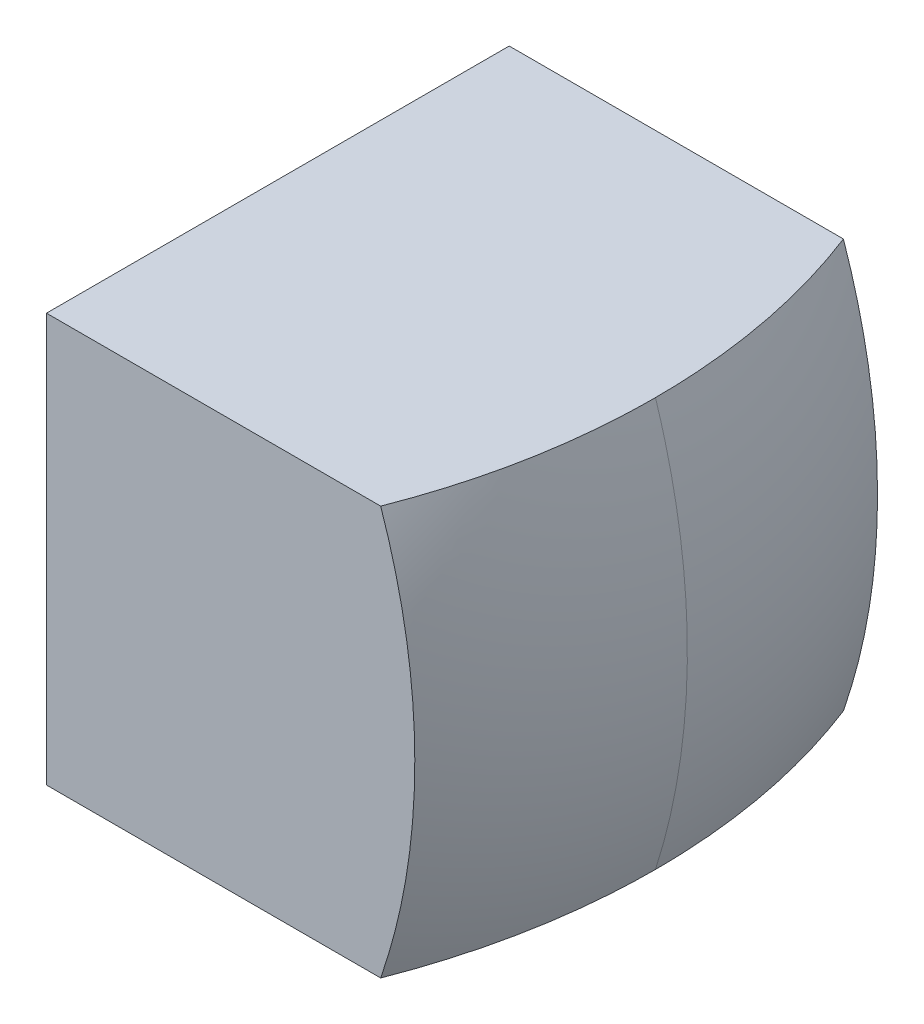
ISO-10303-21;
HEADER;
FILE_DESCRIPTION(('STEP AP214'),'2;1');
FILE_NAME('part.step','',(''),(''),'','','');
FILE_SCHEMA(('AUTOMOTIVE_DESIGN { 1 0 10303 214 1 1 1 1 }'));
ENDSEC;
DATA;
#1=APPLICATION_CONTEXT('core data for automotive mechanical design processes');
#2=APPLICATION_PROTOCOL_DEFINITION('international standard','automotive_design',2000,#1);
#3=PRODUCT_CONTEXT('',#1,'mechanical');
#4=PRODUCT('Part','Part','',(#3));
#5=PRODUCT_RELATED_PRODUCT_CATEGORY('part','',(#4));
#6=PRODUCT_DEFINITION_FORMATION('','',#4);
#7=PRODUCT_DEFINITION_CONTEXT('part definition',#1,'design');
#8=PRODUCT_DEFINITION('design','',#6,#7);
#9=PRODUCT_DEFINITION_SHAPE('','',#8);
#10=(LENGTH_UNIT() NAMED_UNIT(*) SI_UNIT(.MILLI.,.METRE.));
#11=(NAMED_UNIT(*) PLANE_ANGLE_UNIT() SI_UNIT($,.RADIAN.));
#12=(NAMED_UNIT(*) SI_UNIT($,.STERADIAN.) SOLID_ANGLE_UNIT());
#13=UNCERTAINTY_MEASURE_WITH_UNIT(LENGTH_MEASURE(1.E-05),#10,'distance_accuracy_value','');
#14=(GEOMETRIC_REPRESENTATION_CONTEXT(3) GLOBAL_UNCERTAINTY_ASSIGNED_CONTEXT((#13)) GLOBAL_UNIT_ASSIGNED_CONTEXT((#10,
#11,#12)) REPRESENTATION_CONTEXT('',''));
#15=CARTESIAN_POINT('',(0.,0.,0.));
#16=DIRECTION('',(0.,0.,1.));
#17=DIRECTION('',(1.,0.,0.));
#18=AXIS2_PLACEMENT_3D('',#15,#16,#17);
#19=CARTESIAN_POINT('',(46.0120116021939,1.10011595924363,13.8220300666774));
#20=CARTESIAN_POINT('',(46.0120116021939,1.10011595924363,10.2396699333859));
#21=CARTESIAN_POINT('',(43.0594225775192,1.10011595924363,13.8220300666774));
#22=CARTESIAN_POINT('',(43.0594225775192,1.10011595924363,10.2396699333859));
#23=(BOUNDED_SURFACE() B_SPLINE_SURFACE(1,1,((#19,#20),(#21,#22)),.UNSPECIFIED.,.F.,.F.,
.F.) B_SPLINE_SURFACE_WITH_KNOTS((2,2),(2,2),(0.100820794100618,0.337915628214131),(0.,
3.58236013329152),.UNSPECIFIED.) GEOMETRIC_REPRESENTATION_ITEM() RATIONAL_B_SPLINE_SURFACE(((1.,
1.),(1.,1.))) REPRESENTATION_ITEM('') SURFACE());
#24=CARTESIAN_POINT('',(45.6467437334242,1.10011595924363,13.8220300666774));
#25=CARTESIAN_POINT('',(43.0594225775192,1.10011595924363,13.8220300666774));
#26=(BOUNDED_CURVE() B_SPLINE_CURVE(1,(#24,#25),.UNSPECIFIED.,.F.,
.F.) B_SPLINE_CURVE_WITH_KNOTS((2,2),(0.130152043397151,0.337915628214131),
.UNSPECIFIED.) CURVE() GEOMETRIC_REPRESENTATION_ITEM() RATIONAL_B_SPLINE_CURVE((1.,1.)) REPRESENTATION_ITEM(''));
#27=CARTESIAN_POINT('',(45.6467437334242,1.10011595924363,13.8220300666774));
#28=VERTEX_POINT('',#27);
#29=CARTESIAN_POINT('',(43.0594225775192,1.10011595924363,13.8220300666774));
#30=VERTEX_POINT('',#29);
#31=EDGE_CURVE('E11',#28,#30,#26,.T.);
#32=CARTESIAN_POINT('',(43.0594225775192,1.10011595924363,13.8220300666774));
#33=CARTESIAN_POINT('',(43.0594225775192,1.10011595924363,10.2396699333859));
#34=(BOUNDED_CURVE() B_SPLINE_CURVE(1,(#32,#33),.UNSPECIFIED.,.F.,
.F.) B_SPLINE_CURVE_WITH_KNOTS((2,2),(0.241472547059788,0.58547495930637),
.UNSPECIFIED.) CURVE() GEOMETRIC_REPRESENTATION_ITEM() RATIONAL_B_SPLINE_CURVE((1.,1.)) REPRESENTATION_ITEM(''));
#35=CARTESIAN_POINT('',(43.0594225775192,1.10011595924363,10.2396699333859));
#36=VERTEX_POINT('',#35);
#37=EDGE_CURVE('E32',#30,#36,#34,.T.);
#38=CARTESIAN_POINT('',(45.6467437334242,1.10011595924363,10.2396699333859));
#39=CARTESIAN_POINT('',(43.0594225775192,1.10011595924363,10.2396699333859));
#40=(BOUNDED_CURVE() B_SPLINE_CURVE(1,(#38,#39),.UNSPECIFIED.,.F.,
.F.) B_SPLINE_CURVE_WITH_KNOTS((2,2),(0.130152043397154,0.337915628214131),
.UNSPECIFIED.) CURVE() GEOMETRIC_REPRESENTATION_ITEM() RATIONAL_B_SPLINE_CURVE((1.,1.)) REPRESENTATION_ITEM(''));
#41=CARTESIAN_POINT('',(45.6467437334242,1.10011595924363,10.2396699333859));
#42=VERTEX_POINT('',#41);
#43=EDGE_CURVE('E64',#42,#36,#40,.T.);
#44=CARTESIAN_POINT('',(45.6467437334242,1.10011595924363,10.2396699333859));
#45=CARTESIAN_POINT('',(45.6746413466308,1.10011595924363,10.311391140563));
#46=CARTESIAN_POINT('',(45.700912512818,1.10011595924363,10.3837482841693));
#47=CARTESIAN_POINT('',(45.7499325166477,1.10011595924363,10.5291260981025));
#48=CARTESIAN_POINT('',(45.7727029701814,1.10011595924363,10.6021394835508));
#49=CARTESIAN_POINT('',(45.8147229447049,1.10011595924363,10.748830082009));
#50=CARTESIAN_POINT('',(45.833987348376,1.10011595924363,10.8225030267512));
#51=CARTESIAN_POINT('',(45.8690035312854,1.10011595924363,10.9705087469922));
#52=CARTESIAN_POINT('',(45.8847629152138,1.10011595924363,11.0448397228472));
#53=CARTESIAN_POINT('',(45.9127760227394,1.10011595924363,11.1941593539199));
#54=CARTESIAN_POINT('',(45.9250297463366,1.10011595924363,11.2691480091377));
#55=CARTESIAN_POINT('',(45.9460397426095,1.10011595924363,11.419781359848));
#56=CARTESIAN_POINT('',(45.9547882754123,1.10011595924363,11.4954271344132));
#57=CARTESIAN_POINT('',(45.9687940539912,1.10011595924363,11.6473733357523));
#58=CARTESIAN_POINT('',(45.9740358820317,1.10011595924363,11.7236751787677));
#59=CARTESIAN_POINT('',(45.9810417965417,1.10011595924363,11.8769350454039));
#60=CARTESIAN_POINT('',(45.9827830965304,1.10011595924363,11.9538941142524));
#61=CARTESIAN_POINT('',(45.9827780474941,1.10011595924363,12.0308500000317));
#62=B_SPLINE_CURVE_WITH_KNOTS('',3,(#44,#45,#46,#47,#48,#49,#50,#51,#52,#53,#54,#55,#56,#57,#58,
#59,#60,#61),.UNSPECIFIED.,.F.,.F.,(4,2,2,2,2,2,2,2,4),(0.,0.230852412872532,0.460216566010713,
0.68858315774853,0.916449331105873,1.14431550446321,1.37268209620099,1.60204624933912,
1.83289866221158),.UNSPECIFIED.);
#63=CARTESIAN_POINT('',(45.9827780474941,1.10011595924362,12.0308500000317));
#64=VERTEX_POINT('',#63);
#65=EDGE_CURVE('E106',#42,#64,#62,.T.);
#66=CARTESIAN_POINT('',(45.6467437334242,1.10011595924362,13.8220300666774));
#67=CARTESIAN_POINT('',(45.9827780474941,1.10011595924362,12.9579608900052));
#68=CARTESIAN_POINT('',(45.9827780474941,1.10011595924362,12.0308500000317));
#69=(BOUNDED_CURVE() B_SPLINE_CURVE(2,(#66,#67,#68),.UNSPECIFIED.,.F.,
.F.) B_SPLINE_CURVE_WITH_KNOTS((3,3),(0.,0.0615457496856045),
.UNSPECIFIED.) CURVE() GEOMETRIC_REPRESENTATION_ITEM() RATIONAL_B_SPLINE_CURVE((0.805461343263285,
0.838539628741929,0.903701310809624)) REPRESENTATION_ITEM(''));
#70=EDGE_CURVE('E77',#28,#64,#69,.T.);
#71=ORIENTED_EDGE('',*,*,#31,.T.);
#72=ORIENTED_EDGE('',*,*,#37,.T.);
#73=ORIENTED_EDGE('',*,*,#43,.F.);
#74=ORIENTED_EDGE('',*,*,#65,.T.);
#75=ORIENTED_EDGE('',*,*,#70,.F.);
#76=EDGE_LOOP('',(#71,#72,#73,#74,#75));
#77=FACE_BOUND('',#76,.T.);
#78=ADVANCED_FACE('F17',(#77),#23,.T.);
#79=CARTESIAN_POINT('',(45.9393417013262,4.26388404173714,13.8220300666774));
#80=CARTESIAN_POINT('',(45.9393417013262,1.10011595924363,13.8220300666774));
#81=CARTESIAN_POINT('',(43.0594225775192,4.26388404173714,13.8220300666774));
#82=CARTESIAN_POINT('',(43.0594225775192,1.10011595924363,13.8220300666774));
#83=(BOUNDED_SURFACE() B_SPLINE_SURFACE(1,1,((#79,#80),(#81,#82)),.UNSPECIFIED.,.F.,.F.,
.F.) B_SPLINE_SURFACE_WITH_KNOTS((2,2),(2,2),(0.106656234775653,0.337915628214131),
(10.3284883490766,13.4922564315701),
.UNSPECIFIED.) GEOMETRIC_REPRESENTATION_ITEM() RATIONAL_B_SPLINE_SURFACE(((1.,1.),(1.,1.))) REPRESENTATION_ITEM('') SURFACE());
#84=CARTESIAN_POINT('',(45.6467437334242,4.26388404173715,13.8220300666774));
#85=CARTESIAN_POINT('',(43.0594225775192,4.26388404173715,13.8220300666774));
#86=(BOUNDED_CURVE() B_SPLINE_CURVE(1,(#84,#85),.UNSPECIFIED.,.F.,
.F.) B_SPLINE_CURVE_WITH_KNOTS((2,2),(0.130152043397151,0.337915628214132),
.UNSPECIFIED.) CURVE() GEOMETRIC_REPRESENTATION_ITEM() RATIONAL_B_SPLINE_CURVE((1.,1.)) REPRESENTATION_ITEM(''));
#87=CARTESIAN_POINT('',(45.6467437334242,4.26388404173715,13.8220300666774));
#88=VERTEX_POINT('',#87);
#89=CARTESIAN_POINT('',(43.0594225775192,4.26388404173715,13.8220300666774));
#90=VERTEX_POINT('',#89);
#91=EDGE_CURVE('E99',#88,#90,#86,.T.);
#92=CARTESIAN_POINT('',(43.0594225775192,4.26388404173715,13.8220300666774));
#93=CARTESIAN_POINT('',(43.0594225775192,1.10011595924363,13.8220300666774));
#94=(BOUNDED_CURVE() B_SPLINE_CURVE(1,(#92,#93),.UNSPECIFIED.,.F.,
.F.) B_SPLINE_CURVE_WITH_KNOTS((2,2),(0.37297367455752,0.62702632544248),
.UNSPECIFIED.) CURVE() GEOMETRIC_REPRESENTATION_ITEM() RATIONAL_B_SPLINE_CURVE((1.,1.)) REPRESENTATION_ITEM(''));
#95=EDGE_CURVE('E93',#90,#30,#94,.T.);
#96=CARTESIAN_POINT('',(45.6467437334242,1.10011595924363,13.8220300666774));
#97=CARTESIAN_POINT('',(45.6682163895113,1.16262633496551,13.8220300666774));
#98=CARTESIAN_POINT('',(45.6884443266542,1.22556588971209,13.8220300666774));
#99=CARTESIAN_POINT('',(45.7262536740498,1.35189904070749,13.8220300666774));
#100=CARTESIAN_POINT('',(45.7438475546214,1.41528890621681,13.8220300666774));
#101=CARTESIAN_POINT('',(45.7763895623177,1.54252282748788,13.8220300666774));
#102=CARTESIAN_POINT('',(45.7913461931653,1.60636470639489,13.8220300666774));
#103=CARTESIAN_POINT('',(45.8186185722097,1.73450059915981,13.8220300666774));
#104=CARTESIAN_POINT('',(45.8309386159855,1.79879369859243,13.8220300666774));
#105=CARTESIAN_POINT('',(45.8529418929331,1.92783096184274,13.8220300666774));
#106=CARTESIAN_POINT('',(45.8626250700356,1.99257513522191,13.8220300666774));
#107=CARTESIAN_POINT('',(45.8793590108542,2.12251360984817,13.8220300666774));
#108=CARTESIAN_POINT('',(45.8864053063488,2.18770848618212,13.8220300666774));
#109=CARTESIAN_POINT('',(45.8978700819682,2.31854799134591,13.8220300666774));
#110=CARTESIAN_POINT('',(45.902279710447,2.38419339504039,13.8220300666774));
#111=CARTESIAN_POINT('',(45.9084748022754,2.51593338632832,13.8220300666774));
#112=CARTESIAN_POINT('',(45.9102471411727,2.58202858688365,13.8220300666774));
#113=CARTESIAN_POINT('',(45.9111915761511,2.71710202699207,13.8220300666774));
#114=CARTESIAN_POINT('',(45.9102476867956,2.78608110660097,13.8220300666774));
#115=CARTESIAN_POINT('',(45.9054713512584,2.92357184437422,13.8220300666774));
#116=CARTESIAN_POINT('',(45.9016543206453,2.99208403494511,13.8220300666774));
#117=CARTESIAN_POINT('',(45.8911358393136,3.12864036746371,13.8220300666774));
#118=CARTESIAN_POINT('',(45.8844447620483,3.1966853069589,13.8220300666774));
#119=CARTESIAN_POINT('',(45.8681835570111,3.33230695407932,13.8220300666774));
#120=CARTESIAN_POINT('',(45.8586186042749,3.39988428182429,13.8220300666774));
#121=CARTESIAN_POINT('',(45.8366147877765,3.53457091588573,13.8220300666774));
#122=CARTESIAN_POINT('',(45.824175860949,3.60168021189863,13.8220300666774));
#123=CARTESIAN_POINT('',(45.796429623606,3.73543166045242,13.8220300666774));
#124=CARTESIAN_POINT('',(45.7811170859164,3.80207272840372,13.8220300666774));
#125=CARTESIAN_POINT('',(45.7476278402023,3.93488825299946,13.8220300666774));
#126=CARTESIAN_POINT('',(45.7294409222044,4.00106013260824,13.8220300666774));
#127=CARTESIAN_POINT('',(45.6902113435536,4.13294117755481,13.8220300666774));
#128=CARTESIAN_POINT('',(45.6691537973993,4.19864591695585,13.8220300666774));
#129=CARTESIAN_POINT('',(45.6467437334242,4.26388404173714,13.8220300666774));
#130=B_SPLINE_CURVE_WITH_KNOTS('',3,(#96,#97,#98,#99,#100,#101,#102,#103,#104,#105,#106,#107,
#108,#109,#110,#111,#112,#113,#114,#115,#116,#117,#118,#119,#120,#121,#122,#123,#124,#125,#126,
#127,#128,#129),.UNSPECIFIED.,.F.,.F.,(4,2,2,2,2,2,2,2,2,2,2,2,2,2,2,2,4),(0.,0.198275812146389,
0.395581043796415,0.592237949778073,0.78857197735286,0.984910179384063,1.18157958790914,
1.37890558822845,1.57721033359293,1.78410685800623,1.98990114172378,2.19495880143062,
2.39964940110527,2.60434449284661,2.80941560433707,3.01523222696502,3.22215985858805),.UNSPECIFIED.);
#131=EDGE_CURVE('E86',#28,#88,#130,.T.);
#132=ORIENTED_EDGE('',*,*,#91,.T.);
#133=ORIENTED_EDGE('',*,*,#95,.T.);
#134=ORIENTED_EDGE('',*,*,#31,.F.);
#135=ORIENTED_EDGE('',*,*,#131,.T.);
#136=EDGE_LOOP('',(#132,#133,#134,#135));
#137=FACE_BOUND('',#136,.T.);
#138=ADVANCED_FACE('F101',(#137),#83,.T.);
#139=CARTESIAN_POINT('',(46.0120116021939,4.26388404173715,10.2396699333859));
#140=CARTESIAN_POINT('',(46.0120116021939,4.26388404173715,13.8220300666774));
#141=CARTESIAN_POINT('',(43.0594225775192,4.26388404173715,10.2396699333859));
#142=CARTESIAN_POINT('',(43.0594225775192,4.26388404173715,13.8220300666774));
#143=(BOUNDED_SURFACE() B_SPLINE_SURFACE(1,1,((#139,#140),(#141,#142)),.UNSPECIFIED.,.F.,.F.,
.F.) B_SPLINE_SURFACE_WITH_KNOTS((2,2),(2,2),(0.10082079410062,0.337915628214132),
(6.74612821578504,10.3284883490766),
.UNSPECIFIED.) GEOMETRIC_REPRESENTATION_ITEM() RATIONAL_B_SPLINE_SURFACE(((1.,1.),(1.,1.))) REPRESENTATION_ITEM('') SURFACE());
#144=CARTESIAN_POINT('',(45.6467437334242,4.26388404173715,10.2396699333859));
#145=CARTESIAN_POINT('',(43.0594225775192,4.26388404173715,10.2396699333859));
#146=(BOUNDED_CURVE() B_SPLINE_CURVE(1,(#144,#145),.UNSPECIFIED.,.F.,
.F.) B_SPLINE_CURVE_WITH_KNOTS((2,2),(0.130152043397155,0.337915628214131),
.UNSPECIFIED.) CURVE() GEOMETRIC_REPRESENTATION_ITEM() RATIONAL_B_SPLINE_CURVE((1.,1.)) REPRESENTATION_ITEM(''));
#147=CARTESIAN_POINT('',(45.6467437334242,4.26388404173715,10.2396699333859));
#148=VERTEX_POINT('',#147);
#149=CARTESIAN_POINT('',(43.0594225775192,4.26388404173715,10.2396699333859));
#150=VERTEX_POINT('',#149);
#151=EDGE_CURVE('E111',#148,#150,#146,.T.);
#152=CARTESIAN_POINT('',(43.0594225775192,4.26388404173714,10.2396699333859));
#153=CARTESIAN_POINT('',(43.0594225775192,4.26388404173715,13.8220300666774));
#154=(BOUNDED_CURVE() B_SPLINE_CURVE(1,(#152,#153),.UNSPECIFIED.,.F.,
.F.) B_SPLINE_CURVE_WITH_KNOTS((2,2),(0.414525040693629,0.758527452940212),
.UNSPECIFIED.) CURVE() GEOMETRIC_REPRESENTATION_ITEM() RATIONAL_B_SPLINE_CURVE((1.,1.)) REPRESENTATION_ITEM(''));
#155=EDGE_CURVE('E96',#150,#90,#154,.T.);
#156=CARTESIAN_POINT('',(45.6467437334242,4.26388404173715,13.8220300666774));
#157=CARTESIAN_POINT('',(45.6746413466308,4.26388404173715,13.7503088595004));
#158=CARTESIAN_POINT('',(45.700912512818,4.26388404173715,13.6779517158942));
#159=CARTESIAN_POINT('',(45.7499325166477,4.26388404173715,13.532573901961));
#160=CARTESIAN_POINT('',(45.7727029701814,4.26388404173715,13.4595605165128));
#161=CARTESIAN_POINT('',(45.8147229447049,4.26388404173715,13.3128699180547));
#162=CARTESIAN_POINT('',(45.833987348376,4.26388404173715,13.2391969733125));
#163=CARTESIAN_POINT('',(45.8690035312854,4.26388404173715,13.0911912530716));
#164=CARTESIAN_POINT('',(45.8847629152138,4.26388404173715,13.0168602772166));
#165=CARTESIAN_POINT('',(45.9127760227394,4.26388404173715,12.8675406461438));
#166=CARTESIAN_POINT('',(45.9250297463366,4.26388404173715,12.7925519909261));
#167=CARTESIAN_POINT('',(45.9460397426095,4.26388404173715,12.6419186402158));
#168=CARTESIAN_POINT('',(45.9547882754123,4.26388404173715,12.5662728656505));
#169=CARTESIAN_POINT('',(45.9687940539912,4.26388404173715,12.4143266643113));
#170=CARTESIAN_POINT('',(45.9740358820317,4.26388404173715,12.3380248212959));
#171=CARTESIAN_POINT('',(45.9810417965417,4.26388404173715,12.1847649546596));
#172=CARTESIAN_POINT('',(45.9827830965304,4.26388404173715,12.107805885811));
#173=CARTESIAN_POINT('',(45.9827780474941,4.26388404173715,12.0308500000317));
#174=B_SPLINE_CURVE_WITH_KNOTS('',3,(#156,#157,#158,#159,#160,#161,#162,#163,#164,#165,#166,
#167,#168,#169,#170,#171,#172,#173),.UNSPECIFIED.,.F.,.F.,(4,2,2,2,2,2,2,2,4),(0.,
0.230852412872342,0.460216566010386,0.688583157748114,0.916449331105418,1.14431550446276,
1.37268209620062,1.60204624933887,1.8328986622115),.UNSPECIFIED.);
#175=CARTESIAN_POINT('',(45.9827780474941,4.26388404173716,12.0308500000317));
#176=VERTEX_POINT('',#175);
#177=EDGE_CURVE('E114',#88,#176,#174,.T.);
#178=CARTESIAN_POINT('',(45.6467437334242,4.26388404173715,10.2396699333859));
#179=CARTESIAN_POINT('',(45.9827780474941,4.26388404173715,11.1037391100582));
#180=CARTESIAN_POINT('',(45.9827780474941,4.26388404173715,12.0308500000317));
#181=(BOUNDED_CURVE() B_SPLINE_CURVE(2,(#178,#179,#180),.UNSPECIFIED.,.F.,
.F.) B_SPLINE_CURVE_WITH_KNOTS((3,3),(0.938454250314391,1.),
.UNSPECIFIED.) CURVE() GEOMETRIC_REPRESENTATION_ITEM() RATIONAL_B_SPLINE_CURVE((0.80546134326328,
0.838539628741925,0.903701310809624)) REPRESENTATION_ITEM(''));
#182=EDGE_CURVE('E209',#148,#176,#181,.T.);
#183=ORIENTED_EDGE('',*,*,#151,.T.);
#184=ORIENTED_EDGE('',*,*,#155,.T.);
#185=ORIENTED_EDGE('',*,*,#91,.F.);
#186=ORIENTED_EDGE('',*,*,#177,.T.);
#187=ORIENTED_EDGE('',*,*,#182,.F.);
#188=EDGE_LOOP('',(#183,#184,#185,#186,#187));
#189=FACE_BOUND('',#188,.T.);
#190=ADVANCED_FACE('F108',(#189),#143,.T.);
#191=CARTESIAN_POINT('',(45.9827780474941,1.10011595924362,12.0308500000317));
#192=CARTESIAN_POINT('',(45.9827780474941,1.10011595924362,12.9579608900052));
#193=CARTESIAN_POINT('',(45.6467437334242,1.10011595924362,13.8220300666774));
#194=CARTESIAN_POINT('',(46.2297864218097,1.87177302111177,12.0308500000317));
#195=CARTESIAN_POINT('',(46.2297864218097,1.87177302111177,13.0043008929889));
#196=CARTESIAN_POINT('',(45.8769560251082,1.87177302111177,13.9115590437721));
#197=CARTESIAN_POINT('',(46.2297864218097,2.68200000049039,12.0308500000317));
#198=CARTESIAN_POINT('',(46.2297864218097,2.68200000049039,13.0043008929889));
#199=CARTESIAN_POINT('',(45.8769560251082,2.68200000049039,13.9115590437721));
#200=CARTESIAN_POINT('',(46.2297864218097,3.49222697986901,12.0308500000317));
#201=CARTESIAN_POINT('',(46.2297864218097,3.49222697986901,13.0043008929889));
#202=CARTESIAN_POINT('',(45.8769560251082,3.49222697986901,13.9115590437721));
#203=CARTESIAN_POINT('',(45.9827780474941,4.26388404173715,12.0308500000317));
#204=CARTESIAN_POINT('',(45.9827780474941,4.26388404173715,12.9579608900052));
#205=CARTESIAN_POINT('',(45.6467437334242,4.26388404173715,13.8220300666774));
#206=(BOUNDED_SURFACE() B_SPLINE_SURFACE(2,2,((#191,#192,#193),(#194,#195,#196),(#197,#198,
#199),(#200,#201,#202),(#203,#204,#205)),.UNSPECIFIED.,.F.,.F.,
.F.) B_SPLINE_SURFACE_WITH_KNOTS((3,2,3),(3,3),(0.396294099901306,0.5,0.603705900098694),(0.,
0.0615457496856045),
.UNSPECIFIED.) GEOMETRIC_REPRESENTATION_ITEM() RATIONAL_B_SPLINE_SURFACE(((0.903701310809624,
0.838539628741929,0.805461343263285),(0.939250490220294,0.871525522807301,0.837146026529234),
(1.,0.927894669081185,0.891291551344187),(0.939250490220294,0.871525522807301,
0.837146026529234),(0.903701310809624,0.838539628741929,0.805461343263285))) REPRESENTATION_ITEM('') SURFACE());
#207=CARTESIAN_POINT('',(45.9827780474941,1.10011595924362,12.0308500000317));
#208=CARTESIAN_POINT('',(46.2297864218097,1.87177302111177,12.0308500000317));
#209=CARTESIAN_POINT('',(46.2297864218097,2.68200000049039,12.0308500000317));
#210=CARTESIAN_POINT('',(46.2297864218097,3.49222697986901,12.0308500000317));
#211=CARTESIAN_POINT('',(45.9827780474941,4.26388404173716,12.0308500000317));
#212=(BOUNDED_CURVE() B_SPLINE_CURVE(2,(#207,#208,#209,#210,#211),.UNSPECIFIED.,.F.,
.F.) B_SPLINE_CURVE_WITH_KNOTS((3,2,3),(0.396294099901306,0.5,0.603705900098694),
.UNSPECIFIED.) CURVE() GEOMETRIC_REPRESENTATION_ITEM() RATIONAL_B_SPLINE_CURVE((0.903701310809624,
0.939250490220294,1.,0.939250490220294,0.903701310809624)) REPRESENTATION_ITEM(''));
#213=EDGE_CURVE('E122',#64,#176,#212,.T.);
#214=ORIENTED_EDGE('',*,*,#213,.T.);
#215=ORIENTED_EDGE('',*,*,#177,.F.);
#216=ORIENTED_EDGE('',*,*,#131,.F.);
#217=ORIENTED_EDGE('',*,*,#70,.T.);
#218=EDGE_LOOP('',(#214,#215,#216,#217));
#219=FACE_BOUND('',#218,.T.);
#220=ADVANCED_FACE('F181',(#219),#206,.T.);
#221=CARTESIAN_POINT('',(45.6467437334242,1.10011595924362,10.2396699333859));
#222=CARTESIAN_POINT('',(45.9827780474941,1.10011595924362,11.1037391100582));
#223=CARTESIAN_POINT('',(45.9827780474941,1.10011595924362,12.0308500000317));
#224=CARTESIAN_POINT('',(45.8769560251082,1.87177302111177,10.1501409562912));
#225=CARTESIAN_POINT('',(46.2297864218097,1.87177302111177,11.0573991070745));
#226=CARTESIAN_POINT('',(46.2297864218097,1.87177302111177,12.0308500000317));
#227=CARTESIAN_POINT('',(45.8769560251082,2.68200000049039,10.1501409562912));
#228=CARTESIAN_POINT('',(46.2297864218097,2.68200000049039,11.0573991070745));
#229=CARTESIAN_POINT('',(46.2297864218097,2.68200000049039,12.0308500000317));
#230=CARTESIAN_POINT('',(45.8769560251082,3.49222697986901,10.1501409562912));
#231=CARTESIAN_POINT('',(46.2297864218097,3.49222697986901,11.0573991070745));
#232=CARTESIAN_POINT('',(46.2297864218097,3.49222697986901,12.0308500000317));
#233=CARTESIAN_POINT('',(45.6467437334242,4.26388404173715,10.2396699333859));
#234=CARTESIAN_POINT('',(45.9827780474941,4.26388404173715,11.1037391100582));
#235=CARTESIAN_POINT('',(45.9827780474941,4.26388404173715,12.0308500000317));
#236=(BOUNDED_SURFACE() B_SPLINE_SURFACE(2,2,((#221,#222,#223),(#224,#225,#226),(#227,#228,
#229),(#230,#231,#232),(#233,#234,#235)),.UNSPECIFIED.,.F.,.F.,
.F.) B_SPLINE_SURFACE_WITH_KNOTS((3,2,3),(3,3),(0.396294099901306,0.5,0.603705900098694),
(0.938454250314391,1.),
.UNSPECIFIED.) GEOMETRIC_REPRESENTATION_ITEM() RATIONAL_B_SPLINE_SURFACE(((0.80546134326328,
0.838539628741924,0.903701310809624),(0.837146026529229,0.871525522807296,0.939250490220294),
(0.891291551344181,0.92789466908118,1.),(0.837146026529229,0.871525522807296,0.939250490220294),
(0.80546134326328,0.838539628741925,0.903701310809624))) REPRESENTATION_ITEM('') SURFACE());
#237=CARTESIAN_POINT('',(45.6467437334242,4.26388404173715,10.2396699333859));
#238=CARTESIAN_POINT('',(45.6682163895151,4.20137366600437,10.2396699333859));
#239=CARTESIAN_POINT('',(45.6884443266617,4.13843411124689,10.2396699333859));
#240=CARTESIAN_POINT('',(45.7262536740637,4.01210096023278,10.2396699333859));
#241=CARTESIAN_POINT('',(45.743847554638,3.94871109471568,10.2396699333859));
#242=CARTESIAN_POINT('',(45.7763895623385,3.82147717343214,10.2396699333859));
#243=CARTESIAN_POINT('',(45.7913461931878,3.75763529452046,10.2396699333859));
#244=CARTESIAN_POINT('',(45.8186185722343,3.62949940174929,10.2396699333859));
#245=CARTESIAN_POINT('',(45.8309386160107,3.56520630231512,10.2396699333859));
#246=CARTESIAN_POINT('',(45.8529418929584,3.4361690390648,10.2396699333859));
#247=CARTESIAN_POINT('',(45.8626250700603,3.37142486568719,10.2396699333859));
#248=CARTESIAN_POINT('',(45.8793590108768,3.24148639106715,10.2396699333859));
#249=CARTESIAN_POINT('',(45.8864053063699,3.17629151473787,10.2396699333859));
#250=CARTESIAN_POINT('',(45.8978700819851,3.04545200958654,10.2396699333859));
#251=CARTESIAN_POINT('',(45.9022797104614,2.97980660589984,10.2396699333859));
#252=CARTESIAN_POINT('',(45.9084748022831,2.84806661463059,10.2396699333859));
#253=CARTESIAN_POINT('',(45.9102471411763,2.78197141408615,10.2396699333859));
#254=CARTESIAN_POINT('',(45.9111915761473,2.64689797397773,10.2396699333859));
#255=CARTESIAN_POINT('',(45.9102476867877,2.57791889435793,10.2396699333859));
#256=CARTESIAN_POINT('',(45.9054713512438,2.440428156566,10.2396699333859));
#257=CARTESIAN_POINT('',(45.9016543206282,2.37191596598733,10.2396699333859));
#258=CARTESIAN_POINT('',(45.8911358392923,2.23535963345628,10.2396699333859));
#259=CARTESIAN_POINT('',(45.8844447620255,2.16731469395642,10.2396699333859));
#260=CARTESIAN_POINT('',(45.868183556986,2.03169304682978,10.2396699333859));
#261=CARTESIAN_POINT('',(45.8586186042494,1.96411571908325,10.2396699333859));
#262=CARTESIAN_POINT('',(45.836614787751,1.82942908502183,10.2396699333859));
#263=CARTESIAN_POINT('',(45.8241758609242,1.76231978901049,10.2396699333859));
#264=CARTESIAN_POINT('',(45.7964296235833,1.62856834046293,10.2396699333859));
#265=CARTESIAN_POINT('',(45.7811170858954,1.5619272725163,10.2396699333859));
#266=CARTESIAN_POINT('',(45.7476278401856,1.42911174793303,10.2396699333859));
#267=CARTESIAN_POINT('',(45.7294409221904,1.36293986833202,10.2396699333859));
#268=CARTESIAN_POINT('',(45.690211343546,1.23105882340416,10.2396699333859));
#269=CARTESIAN_POINT('',(45.6691537973956,1.16535408401401,10.2396699333859));
#270=CARTESIAN_POINT('',(45.6467437334242,1.10011595924363,10.2396699333859));
#271=B_SPLINE_CURVE_WITH_KNOTS('',3,(#237,#238,#239,#240,#241,#242,#243,#244,#245,#246,#247,
#248,#249,#250,#251,#252,#253,#254,#255,#256,#257,#258,#259,#260,#261,#262,#263,#264,#265,#266,
#267,#268,#269,#270),.UNSPECIFIED.,.F.,.F.,(4,2,2,2,2,2,2,2,2,2,2,2,2,2,2,2,4),(0.,
0.198275812180982,0.395581043855675,0.592237949852085,0.788571977431763,0.984910179458103,
1.18157958796871,1.37890558826415,1.5772103335956,1.78410685804179,1.98990114178314,
2.1949588015044,2.39964940118391,2.60434449292037,2.80941560439607,3.01523222699934,
3.22215985858776),.UNSPECIFIED.);
#272=EDGE_CURVE('E133',#148,#42,#271,.T.);
#273=ORIENTED_EDGE('',*,*,#272,.F.);
#274=ORIENTED_EDGE('',*,*,#182,.T.);
#275=ORIENTED_EDGE('',*,*,#213,.F.);
#276=ORIENTED_EDGE('',*,*,#65,.F.);
#277=EDGE_LOOP('',(#273,#274,#275,#276));
#278=FACE_BOUND('',#277,.T.);
#279=ADVANCED_FACE('F168',(#278),#236,.T.);
#280=CARTESIAN_POINT('',(45.9393417013262,1.10011595924363,10.2396699333859));
#281=CARTESIAN_POINT('',(45.9393417013262,4.26388404173715,10.2396699333859));
#282=CARTESIAN_POINT('',(43.0594225775192,1.10011595924363,10.2396699333859));
#283=CARTESIAN_POINT('',(43.0594225775192,4.26388404173715,10.2396699333859));
#284=(BOUNDED_SURFACE() B_SPLINE_SURFACE(1,1,((#280,#281),(#282,#283)),.UNSPECIFIED.,.F.,.F.,
.F.) B_SPLINE_SURFACE_WITH_KNOTS((2,2),(2,2),(0.106656234775658,0.337915628214132),
(3.58236013329152,6.74612821578504),
.UNSPECIFIED.) GEOMETRIC_REPRESENTATION_ITEM() RATIONAL_B_SPLINE_SURFACE(((1.,1.),(1.,1.))) REPRESENTATION_ITEM('') SURFACE());
#285=CARTESIAN_POINT('',(43.0594225775192,1.10011595924363,10.2396699333859));
#286=CARTESIAN_POINT('',(43.0594225775192,4.26388404173715,10.2396699333859));
#287=(BOUNDED_CURVE() B_SPLINE_CURVE(1,(#285,#286),.UNSPECIFIED.,.F.,
.F.) B_SPLINE_CURVE_WITH_KNOTS((2,2),(0.37297367455752,0.62702632544248),
.UNSPECIFIED.) CURVE() GEOMETRIC_REPRESENTATION_ITEM() RATIONAL_B_SPLINE_CURVE((1.,1.)) REPRESENTATION_ITEM(''));
#288=EDGE_CURVE('E126',#36,#150,#287,.T.);
#289=ORIENTED_EDGE('',*,*,#43,.T.);
#290=ORIENTED_EDGE('',*,*,#288,.T.);
#291=ORIENTED_EDGE('',*,*,#151,.F.);
#292=ORIENTED_EDGE('',*,*,#272,.T.);
#293=EDGE_LOOP('',(#289,#290,#291,#292));
#294=FACE_BOUND('',#293,.T.);
#295=ADVANCED_FACE('F180',(#294),#284,.T.);
#296=CARTESIAN_POINT('',(43.0594225775192,1.10011595924362,10.2396699333859));
#297=CARTESIAN_POINT('',(43.0594225775192,4.26388404173715,10.2396699333859));
#298=CARTESIAN_POINT('',(43.0594225775192,1.10011595924362,13.8220300666774));
#299=CARTESIAN_POINT('',(43.0594225775192,4.26388404173715,13.8220300666774));
#300=(BOUNDED_SURFACE() B_SPLINE_SURFACE(1,1,((#296,#297),(#298,#299)),.UNSPECIFIED.,.F.,.F.,
.F.) B_SPLINE_SURFACE_WITH_KNOTS((2,2),(2,2),(17.5926647808948,21.1750249141863),
(0.37297367455752,0.62702632544248),
.UNSPECIFIED.) GEOMETRIC_REPRESENTATION_ITEM() RATIONAL_B_SPLINE_SURFACE(((1.,1.),(1.,1.))) REPRESENTATION_ITEM('') SURFACE());
#301=ORIENTED_EDGE('',*,*,#155,.F.);
#302=ORIENTED_EDGE('',*,*,#288,.F.);
#303=ORIENTED_EDGE('',*,*,#37,.F.);
#304=ORIENTED_EDGE('',*,*,#95,.F.);
#305=EDGE_LOOP('',(#301,#302,#303,#304));
#306=FACE_BOUND('',#305,.T.);
#307=ADVANCED_FACE('F94',(#306),#300,.T.);
#308=CLOSED_SHELL('',(#78,#138,#190,#220,#279,#295,#307));
#309=MANIFOLD_SOLID_BREP('B1',#308);
#310=ADVANCED_BREP_SHAPE_REPRESENTATION('',(#18,#309),#14);
#311=SHAPE_DEFINITION_REPRESENTATION(#9,#310);
ENDSEC;
END-ISO-10303-21;
